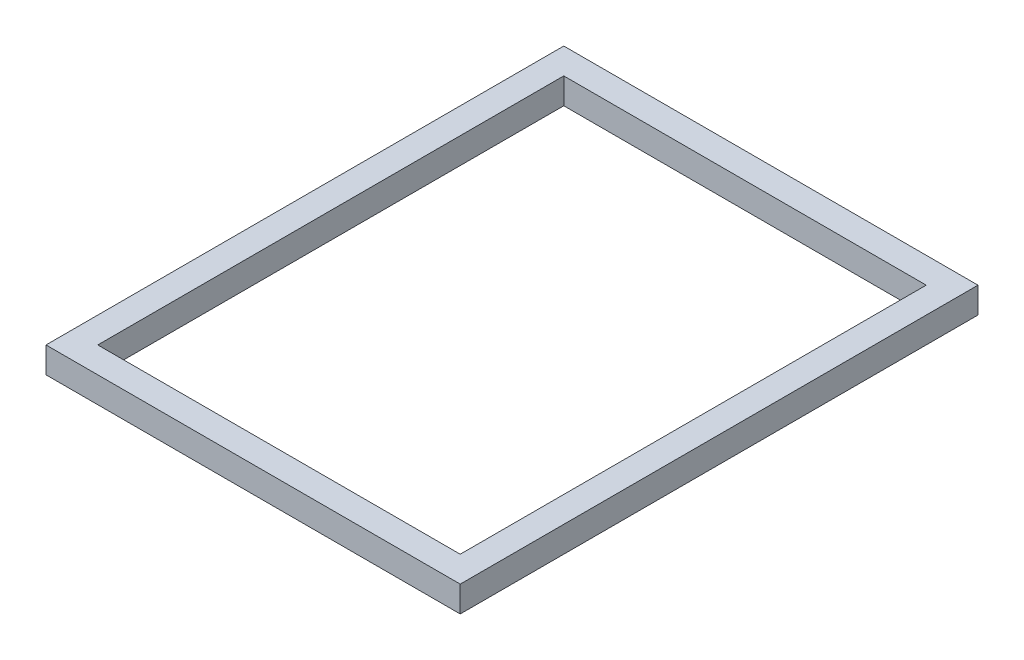
ISO-10303-21;
HEADER;
FILE_DESCRIPTION(('STEP AP214'),'2;1');
FILE_NAME('part.step','',(''),(''),'','','');
FILE_SCHEMA(('AUTOMOTIVE_DESIGN { 1 0 10303 214 1 1 1 1 }'));
ENDSEC;
DATA;
#1=APPLICATION_CONTEXT('core data for automotive mechanical design processes');
#2=APPLICATION_PROTOCOL_DEFINITION('international standard','automotive_design',2000,#1);
#3=PRODUCT_CONTEXT('',#1,'mechanical');
#4=PRODUCT('Part','Part','',(#3));
#5=PRODUCT_RELATED_PRODUCT_CATEGORY('part','',(#4));
#6=PRODUCT_DEFINITION_FORMATION('','',#4);
#7=PRODUCT_DEFINITION_CONTEXT('part definition',#1,'design');
#8=PRODUCT_DEFINITION('design','',#6,#7);
#9=PRODUCT_DEFINITION_SHAPE('','',#8);
#10=(LENGTH_UNIT() NAMED_UNIT(*) SI_UNIT(.MILLI.,.METRE.));
#11=(NAMED_UNIT(*) PLANE_ANGLE_UNIT() SI_UNIT($,.RADIAN.));
#12=(NAMED_UNIT(*) SI_UNIT($,.STERADIAN.) SOLID_ANGLE_UNIT());
#13=UNCERTAINTY_MEASURE_WITH_UNIT(LENGTH_MEASURE(1.E-05),#10,'distance_accuracy_value','');
#14=(GEOMETRIC_REPRESENTATION_CONTEXT(3) GLOBAL_UNCERTAINTY_ASSIGNED_CONTEXT((#13)) GLOBAL_UNIT_ASSIGNED_CONTEXT((#10,
#11,#12)) REPRESENTATION_CONTEXT('',''));
#15=CARTESIAN_POINT('',(0.,0.,0.));
#16=DIRECTION('',(0.,0.,1.));
#17=DIRECTION('',(1.,0.,0.));
#18=AXIS2_PLACEMENT_3D('',#15,#16,#17);
#19=CARTESIAN_POINT('',(0.,1.5875,0.));
#20=DIRECTION('',(0.,-1.,0.));
#21=DIRECTION('',(0.,0.,-1.));
#22=AXIS2_PLACEMENT_3D('',#19,#20,#21);
#23=PLANE('',#22);
#24=DIRECTION('',(0.,0.,1.));
#25=VECTOR('',#24,1.);
#26=CARTESIAN_POINT('',(0.,1.5875,0.));
#27=LINE('',#26,#25);
#28=CARTESIAN_POINT('',(0.,1.5875,-31.75));
#29=VERTEX_POINT('',#28);
#30=CARTESIAN_POINT('',(0.,1.5875,0.));
#31=VERTEX_POINT('',#30);
#32=EDGE_CURVE('E157',#29,#31,#27,.T.);
#33=ORIENTED_EDGE('',*,*,#32,.T.);
#34=DIRECTION('',(1.,0.,0.));
#35=VECTOR('',#34,1.);
#36=CARTESIAN_POINT('',(0.,1.5875,0.));
#37=LINE('',#36,#35);
#38=CARTESIAN_POINT('',(25.4,1.5875,0.));
#39=VERTEX_POINT('',#38);
#40=EDGE_CURVE('E161',#31,#39,#37,.T.);
#41=ORIENTED_EDGE('',*,*,#40,.T.);
#42=DIRECTION('',(0.,0.,-1.));
#43=VECTOR('',#42,1.);
#44=CARTESIAN_POINT('',(25.4,1.5875,0.));
#45=LINE('',#44,#43);
#46=CARTESIAN_POINT('',(25.4,1.5875,-31.75));
#47=VERTEX_POINT('',#46);
#48=EDGE_CURVE('E165',#39,#47,#45,.T.);
#49=ORIENTED_EDGE('',*,*,#48,.T.);
#50=DIRECTION('',(-1.,0.,0.));
#51=VECTOR('',#50,1.);
#52=CARTESIAN_POINT('',(0.,1.5875,-31.75));
#53=LINE('',#52,#51);
#54=EDGE_CURVE('E168',#47,#29,#53,.T.);
#55=ORIENTED_EDGE('',*,*,#54,.T.);
#56=EDGE_LOOP('',(#33,#41,#49,#55));
#57=FACE_BOUND('',#56,.T.);
#58=DIRECTION('',(1.,0.,0.));
#59=VECTOR('',#58,1.);
#60=CARTESIAN_POINT('',(1.5875,1.5875,-1.5875));
#61=LINE('',#60,#59);
#62=CARTESIAN_POINT('',(1.5875,1.5875,-1.5875));
#63=VERTEX_POINT('',#62);
#64=CARTESIAN_POINT('',(23.8125,1.5875,-1.5875));
#65=VERTEX_POINT('',#64);
#66=EDGE_CURVE('E109',#63,#65,#61,.T.);
#67=ORIENTED_EDGE('',*,*,#66,.F.);
#68=DIRECTION('',(0.,0.,1.));
#69=VECTOR('',#68,1.);
#70=CARTESIAN_POINT('',(1.5875,1.5875,-1.5875));
#71=LINE('',#70,#69);
#72=CARTESIAN_POINT('',(1.5875,1.5875,-30.1625));
#73=VERTEX_POINT('',#72);
#74=EDGE_CURVE('E135',#73,#63,#71,.T.);
#75=ORIENTED_EDGE('',*,*,#74,.F.);
#76=DIRECTION('',(-1.,0.,0.));
#77=VECTOR('',#76,1.);
#78=CARTESIAN_POINT('',(1.5875,1.5875,-30.1625));
#79=LINE('',#78,#77);
#80=CARTESIAN_POINT('',(23.8125,1.5875,-30.1625));
#81=VERTEX_POINT('',#80);
#82=EDGE_CURVE('E131',#81,#73,#79,.T.);
#83=ORIENTED_EDGE('',*,*,#82,.F.);
#84=DIRECTION('',(0.,0.,-1.));
#85=VECTOR('',#84,1.);
#86=CARTESIAN_POINT('',(23.8125,1.5875,-1.5875));
#87=LINE('',#86,#85);
#88=EDGE_CURVE('E118',#65,#81,#87,.T.);
#89=ORIENTED_EDGE('',*,*,#88,.F.);
#90=EDGE_LOOP('',(#67,#75,#83,#89));
#91=FACE_BOUND('',#90,.T.);
#92=ADVANCED_FACE('F43',(#57,#91),#23,.F.);
#93=CARTESIAN_POINT('',(0.,0.,0.));
#94=DIRECTION('',(0.,-1.,0.));
#95=DIRECTION('',(0.,0.,-1.));
#96=AXIS2_PLACEMENT_3D('',#93,#94,#95);
#97=PLANE('',#96);
#98=DIRECTION('',(0.,0.,1.));
#99=VECTOR('',#98,1.);
#100=CARTESIAN_POINT('',(0.,0.,0.));
#101=LINE('',#100,#99);
#102=CARTESIAN_POINT('',(0.,0.,-31.75));
#103=VERTEX_POINT('',#102);
#104=CARTESIAN_POINT('',(0.,0.,0.));
#105=VERTEX_POINT('',#104);
#106=EDGE_CURVE('E127',#103,#105,#101,.T.);
#107=ORIENTED_EDGE('',*,*,#106,.F.);
#108=DIRECTION('',(-1.,0.,0.));
#109=VECTOR('',#108,1.);
#110=CARTESIAN_POINT('',(0.,0.,-31.75));
#111=LINE('',#110,#109);
#112=CARTESIAN_POINT('',(25.4,0.,-31.75));
#113=VERTEX_POINT('',#112);
#114=EDGE_CURVE('E162',#113,#103,#111,.T.);
#115=ORIENTED_EDGE('',*,*,#114,.F.);
#116=DIRECTION('',(0.,0.,-1.));
#117=VECTOR('',#116,1.);
#118=CARTESIAN_POINT('',(25.4,0.,0.));
#119=LINE('',#118,#117);
#120=CARTESIAN_POINT('',(25.4,0.,0.));
#121=VERTEX_POINT('',#120);
#122=EDGE_CURVE('E178',#121,#113,#119,.T.);
#123=ORIENTED_EDGE('',*,*,#122,.F.);
#124=DIRECTION('',(1.,0.,0.));
#125=VECTOR('',#124,1.);
#126=CARTESIAN_POINT('',(0.,0.,0.));
#127=LINE('',#126,#125);
#128=EDGE_CURVE('E175',#105,#121,#127,.T.);
#129=ORIENTED_EDGE('',*,*,#128,.F.);
#130=EDGE_LOOP('',(#107,#115,#123,#129));
#131=FACE_BOUND('',#130,.T.);
#132=DIRECTION('',(0.,0.,1.));
#133=VECTOR('',#132,1.);
#134=CARTESIAN_POINT('',(1.5875,0.,-1.5875));
#135=LINE('',#134,#133);
#136=CARTESIAN_POINT('',(1.5875,0.,-30.1625));
#137=VERTEX_POINT('',#136);
#138=CARTESIAN_POINT('',(1.5875,0.,-1.5875));
#139=VERTEX_POINT('',#138);
#140=EDGE_CURVE('E119',#137,#139,#135,.T.);
#141=ORIENTED_EDGE('',*,*,#140,.T.);
#142=DIRECTION('',(1.,0.,0.));
#143=VECTOR('',#142,1.);
#144=CARTESIAN_POINT('',(1.5875,0.,-1.5875));
#145=LINE('',#144,#143);
#146=CARTESIAN_POINT('',(23.8125,0.,-1.5875));
#147=VERTEX_POINT('',#146);
#148=EDGE_CURVE('E67',#139,#147,#145,.T.);
#149=ORIENTED_EDGE('',*,*,#148,.T.);
#150=DIRECTION('',(0.,0.,-1.));
#151=VECTOR('',#150,1.);
#152=CARTESIAN_POINT('',(23.8125,0.,-1.5875));
#153=LINE('',#152,#151);
#154=CARTESIAN_POINT('',(23.8125,0.,-30.1625));
#155=VERTEX_POINT('',#154);
#156=EDGE_CURVE('E125',#147,#155,#153,.T.);
#157=ORIENTED_EDGE('',*,*,#156,.T.);
#158=DIRECTION('',(-1.,0.,0.));
#159=VECTOR('',#158,1.);
#160=CARTESIAN_POINT('',(1.5875,0.,-30.1625));
#161=LINE('',#160,#159);
#162=EDGE_CURVE('E144',#155,#137,#161,.T.);
#163=ORIENTED_EDGE('',*,*,#162,.T.);
#164=EDGE_LOOP('',(#141,#149,#157,#163));
#165=FACE_BOUND('',#164,.T.);
#166=ADVANCED_FACE('F201',(#131,#165),#97,.T.);
#167=CARTESIAN_POINT('',(0.,1.5875,0.));
#168=DIRECTION('',(1.,0.,0.));
#169=DIRECTION('',(0.,0.,-1.));
#170=AXIS2_PLACEMENT_3D('',#167,#168,#169);
#171=PLANE('',#170);
#172=ORIENTED_EDGE('',*,*,#106,.T.);
#173=DIRECTION('',(0.,-1.,0.));
#174=VECTOR('',#173,1.);
#175=CARTESIAN_POINT('',(0.,1.5875,0.));
#176=LINE('',#175,#174);
#177=EDGE_CURVE('E11',#31,#105,#176,.T.);
#178=ORIENTED_EDGE('',*,*,#177,.F.);
#179=ORIENTED_EDGE('',*,*,#32,.F.);
#180=DIRECTION('',(0.,-1.,0.));
#181=VECTOR('',#180,1.);
#182=CARTESIAN_POINT('',(0.,1.5875,-31.75));
#183=LINE('',#182,#181);
#184=EDGE_CURVE('E171',#29,#103,#183,.T.);
#185=ORIENTED_EDGE('',*,*,#184,.T.);
#186=EDGE_LOOP('',(#172,#178,#179,#185));
#187=FACE_BOUND('',#186,.T.);
#188=ADVANCED_FACE('F45',(#187),#171,.F.);
#189=CARTESIAN_POINT('',(0.,1.5875,0.));
#190=DIRECTION('',(0.,0.,-1.));
#191=DIRECTION('',(-1.,0.,0.));
#192=AXIS2_PLACEMENT_3D('',#189,#190,#191);
#193=PLANE('',#192);
#194=ORIENTED_EDGE('',*,*,#128,.T.);
#195=DIRECTION('',(0.,-1.,0.));
#196=VECTOR('',#195,1.);
#197=CARTESIAN_POINT('',(25.4,1.5875,0.));
#198=LINE('',#197,#196);
#199=EDGE_CURVE('E52',#39,#121,#198,.T.);
#200=ORIENTED_EDGE('',*,*,#199,.F.);
#201=ORIENTED_EDGE('',*,*,#40,.F.);
#202=ORIENTED_EDGE('',*,*,#177,.T.);
#203=EDGE_LOOP('',(#194,#200,#201,#202));
#204=FACE_BOUND('',#203,.T.);
#205=ADVANCED_FACE('F211',(#204),#193,.F.);
#206=CARTESIAN_POINT('',(25.4,1.5875,0.));
#207=DIRECTION('',(-1.,0.,0.));
#208=DIRECTION('',(0.,0.,1.));
#209=AXIS2_PLACEMENT_3D('',#206,#207,#208);
#210=PLANE('',#209);
#211=ORIENTED_EDGE('',*,*,#122,.T.);
#212=DIRECTION('',(0.,-1.,0.));
#213=VECTOR('',#212,1.);
#214=CARTESIAN_POINT('',(25.4,1.5875,-31.75));
#215=LINE('',#214,#213);
#216=EDGE_CURVE('E186',#47,#113,#215,.T.);
#217=ORIENTED_EDGE('',*,*,#216,.F.);
#218=ORIENTED_EDGE('',*,*,#48,.F.);
#219=ORIENTED_EDGE('',*,*,#199,.T.);
#220=EDGE_LOOP('',(#211,#217,#218,#219));
#221=FACE_BOUND('',#220,.T.);
#222=ADVANCED_FACE('F195',(#221),#210,.F.);
#223=CARTESIAN_POINT('',(0.,1.5875,-31.75));
#224=DIRECTION('',(0.,0.,1.));
#225=DIRECTION('',(1.,0.,0.));
#226=AXIS2_PLACEMENT_3D('',#223,#224,#225);
#227=PLANE('',#226);
#228=ORIENTED_EDGE('',*,*,#114,.T.);
#229=ORIENTED_EDGE('',*,*,#184,.F.);
#230=ORIENTED_EDGE('',*,*,#54,.F.);
#231=ORIENTED_EDGE('',*,*,#216,.T.);
#232=EDGE_LOOP('',(#228,#229,#230,#231));
#233=FACE_BOUND('',#232,.T.);
#234=ADVANCED_FACE('F205',(#233),#227,.F.);
#235=CARTESIAN_POINT('',(1.5875,1.5875,-1.5875));
#236=DIRECTION('',(0.,0.,-1.));
#237=DIRECTION('',(-1.,0.,0.));
#238=AXIS2_PLACEMENT_3D('',#235,#236,#237);
#239=PLANE('',#238);
#240=ORIENTED_EDGE('',*,*,#148,.F.);
#241=DIRECTION('',(0.,-1.,0.));
#242=VECTOR('',#241,1.);
#243=CARTESIAN_POINT('',(1.5875,1.5875,-1.5875));
#244=LINE('',#243,#242);
#245=EDGE_CURVE('E113',#63,#139,#244,.T.);
#246=ORIENTED_EDGE('',*,*,#245,.F.);
#247=ORIENTED_EDGE('',*,*,#66,.T.);
#248=DIRECTION('',(0.,-1.,0.));
#249=VECTOR('',#248,1.);
#250=CARTESIAN_POINT('',(23.8125,1.5875,-1.5875));
#251=LINE('',#250,#249);
#252=EDGE_CURVE('E112',#65,#147,#251,.T.);
#253=ORIENTED_EDGE('',*,*,#252,.T.);
#254=EDGE_LOOP('',(#240,#246,#247,#253));
#255=FACE_BOUND('',#254,.T.);
#256=ADVANCED_FACE('F111',(#255),#239,.T.);
#257=CARTESIAN_POINT('',(23.8125,1.5875,-1.5875));
#258=DIRECTION('',(-1.,0.,0.));
#259=DIRECTION('',(0.,0.,1.));
#260=AXIS2_PLACEMENT_3D('',#257,#258,#259);
#261=PLANE('',#260);
#262=ORIENTED_EDGE('',*,*,#156,.F.);
#263=ORIENTED_EDGE('',*,*,#252,.F.);
#264=ORIENTED_EDGE('',*,*,#88,.T.);
#265=DIRECTION('',(0.,-1.,0.));
#266=VECTOR('',#265,1.);
#267=CARTESIAN_POINT('',(23.8125,1.5875,-30.1625));
#268=LINE('',#267,#266);
#269=EDGE_CURVE('E128',#81,#155,#268,.T.);
#270=ORIENTED_EDGE('',*,*,#269,.T.);
#271=EDGE_LOOP('',(#262,#263,#264,#270));
#272=FACE_BOUND('',#271,.T.);
#273=ADVANCED_FACE('F122',(#272),#261,.T.);
#274=CARTESIAN_POINT('',(1.5875,1.5875,-30.1625));
#275=DIRECTION('',(0.,0.,1.));
#276=DIRECTION('',(1.,0.,0.));
#277=AXIS2_PLACEMENT_3D('',#274,#275,#276);
#278=PLANE('',#277);
#279=ORIENTED_EDGE('',*,*,#162,.F.);
#280=ORIENTED_EDGE('',*,*,#269,.F.);
#281=ORIENTED_EDGE('',*,*,#82,.T.);
#282=DIRECTION('',(0.,-1.,0.));
#283=VECTOR('',#282,1.);
#284=CARTESIAN_POINT('',(1.5875,1.5875,-30.1625));
#285=LINE('',#284,#283);
#286=EDGE_CURVE('E59',#73,#137,#285,.T.);
#287=ORIENTED_EDGE('',*,*,#286,.T.);
#288=EDGE_LOOP('',(#279,#280,#281,#287));
#289=FACE_BOUND('',#288,.T.);
#290=ADVANCED_FACE('F234',(#289),#278,.T.);
#291=CARTESIAN_POINT('',(1.5875,1.5875,-1.5875));
#292=DIRECTION('',(1.,0.,0.));
#293=DIRECTION('',(0.,0.,-1.));
#294=AXIS2_PLACEMENT_3D('',#291,#292,#293);
#295=PLANE('',#294);
#296=ORIENTED_EDGE('',*,*,#140,.F.);
#297=ORIENTED_EDGE('',*,*,#286,.F.);
#298=ORIENTED_EDGE('',*,*,#74,.T.);
#299=ORIENTED_EDGE('',*,*,#245,.T.);
#300=EDGE_LOOP('',(#296,#297,#298,#299));
#301=FACE_BOUND('',#300,.T.);
#302=ADVANCED_FACE('F238',(#301),#295,.T.);
#303=CLOSED_SHELL('',(#92,#166,#188,#205,#222,#234,#256,#273,#290,#302));
#304=MANIFOLD_SOLID_BREP('B2',#303);
#305=ADVANCED_BREP_SHAPE_REPRESENTATION('',(#18,#304),#14);
#306=SHAPE_DEFINITION_REPRESENTATION(#9,#305);
ENDSEC;
END-ISO-10303-21;
